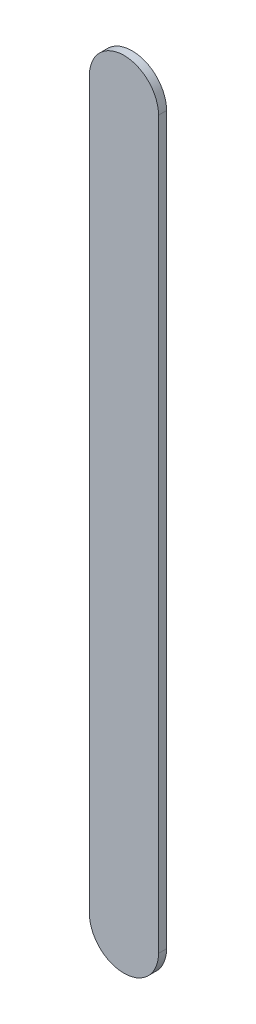
ISO-10303-21;
HEADER;
FILE_DESCRIPTION(('STEP AP214'),'2;1');
FILE_NAME('part.step','',(''),(''),'','','');
FILE_SCHEMA(('AUTOMOTIVE_DESIGN { 1 0 10303 214 1 1 1 1 }'));
ENDSEC;
DATA;
#1=APPLICATION_CONTEXT('core data for automotive mechanical design processes');
#2=APPLICATION_PROTOCOL_DEFINITION('international standard','automotive_design',2000,#1);
#3=PRODUCT_CONTEXT('',#1,'mechanical');
#4=PRODUCT('Part','Part','',(#3));
#5=PRODUCT_RELATED_PRODUCT_CATEGORY('part','',(#4));
#6=PRODUCT_DEFINITION_FORMATION('','',#4);
#7=PRODUCT_DEFINITION_CONTEXT('part definition',#1,'design');
#8=PRODUCT_DEFINITION('design','',#6,#7);
#9=PRODUCT_DEFINITION_SHAPE('','',#8);
#10=(LENGTH_UNIT() NAMED_UNIT(*) SI_UNIT(.MILLI.,.METRE.));
#11=(NAMED_UNIT(*) PLANE_ANGLE_UNIT() SI_UNIT($,.RADIAN.));
#12=(NAMED_UNIT(*) SI_UNIT($,.STERADIAN.) SOLID_ANGLE_UNIT());
#13=UNCERTAINTY_MEASURE_WITH_UNIT(LENGTH_MEASURE(1.E-05),#10,'distance_accuracy_value','');
#14=(GEOMETRIC_REPRESENTATION_CONTEXT(3) GLOBAL_UNCERTAINTY_ASSIGNED_CONTEXT((#13)) GLOBAL_UNIT_ASSIGNED_CONTEXT((#10,
#11,#12)) REPRESENTATION_CONTEXT('',''));
#15=CARTESIAN_POINT('',(0.,0.,0.));
#16=DIRECTION('',(0.,0.,1.));
#17=DIRECTION('',(1.,0.,0.));
#18=AXIS2_PLACEMENT_3D('',#15,#16,#17);
#19=CARTESIAN_POINT('',(131.518,-110.752,1.635));
#20=DIRECTION('',(0.,0.,1.));
#21=DIRECTION('',(1.,0.,0.));
#22=AXIS2_PLACEMENT_3D('',#19,#20,#21);
#23=PLANE('',#22);
#24=DIRECTION('',(0.,-1.,0.));
#25=VECTOR('',#24,1.);
#26=CARTESIAN_POINT('',(131.518,-110.752,1.635));
#27=LINE('',#26,#25);
#28=CARTESIAN_POINT('',(131.518,-110.752,1.635));
#29=VERTEX_POINT('',#28);
#30=CARTESIAN_POINT('',(131.518,-113.904,1.635));
#31=VERTEX_POINT('',#30);
#32=EDGE_CURVE('E93',#29,#31,#27,.T.);
#33=ORIENTED_EDGE('',*,*,#32,.T.);
#34=CARTESIAN_POINT('',(131.668,-113.904,1.635));
#35=DIRECTION('',(0.,0.,1.));
#36=DIRECTION('',(-1.,0.,0.));
#37=AXIS2_PLACEMENT_3D('',#34,#35,#36);
#38=CIRCLE('',#37,0.15);
#39=CARTESIAN_POINT('',(131.818,-113.904,1.635));
#40=VERTEX_POINT('',#39);
#41=EDGE_CURVE('E71',#31,#40,#38,.T.);
#42=ORIENTED_EDGE('',*,*,#41,.T.);
#43=DIRECTION('',(0.,1.,0.));
#44=VECTOR('',#43,1.);
#45=CARTESIAN_POINT('',(131.818,-113.904,1.635));
#46=LINE('',#45,#44);
#47=CARTESIAN_POINT('',(131.818,-110.752,1.635));
#48=VERTEX_POINT('',#47);
#49=EDGE_CURVE('E76',#40,#48,#46,.T.);
#50=ORIENTED_EDGE('',*,*,#49,.T.);
#51=CARTESIAN_POINT('',(131.668,-110.752,1.635));
#52=DIRECTION('',(0.,0.,1.));
#53=DIRECTION('',(1.,0.,0.));
#54=AXIS2_PLACEMENT_3D('',#51,#52,#53);
#55=CIRCLE('',#54,0.15);
#56=EDGE_CURVE('E11',#48,#29,#55,.T.);
#57=ORIENTED_EDGE('',*,*,#56,.T.);
#58=EDGE_LOOP('',(#33,#42,#50,#57));
#59=FACE_BOUND('',#58,.T.);
#60=ADVANCED_FACE('F17',(#59),#23,.T.);
#61=CARTESIAN_POINT('',(131.518,-110.752,1.6));
#62=DIRECTION('',(0.,0.,1.));
#63=DIRECTION('',(1.,0.,0.));
#64=AXIS2_PLACEMENT_3D('',#61,#62,#63);
#65=PLANE('',#64);
#66=CARTESIAN_POINT('',(131.668,-110.752,1.6));
#67=DIRECTION('',(0.,0.,1.));
#68=DIRECTION('',(1.,0.,0.));
#69=AXIS2_PLACEMENT_3D('',#66,#67,#68);
#70=CIRCLE('',#69,0.15);
#71=CARTESIAN_POINT('',(131.818,-110.752,1.6));
#72=VERTEX_POINT('',#71);
#73=CARTESIAN_POINT('',(131.518,-110.752,1.6));
#74=VERTEX_POINT('',#73);
#75=EDGE_CURVE('E20',#72,#74,#70,.T.);
#76=ORIENTED_EDGE('',*,*,#75,.F.);
#77=DIRECTION('',(0.,1.,0.));
#78=VECTOR('',#77,1.);
#79=CARTESIAN_POINT('',(131.818,-113.904,1.6));
#80=LINE('',#79,#78);
#81=CARTESIAN_POINT('',(131.818,-113.904,1.6));
#82=VERTEX_POINT('',#81);
#83=EDGE_CURVE('E60',#82,#72,#80,.T.);
#84=ORIENTED_EDGE('',*,*,#83,.F.);
#85=CARTESIAN_POINT('',(131.668,-113.904,1.6));
#86=DIRECTION('',(0.,0.,1.));
#87=DIRECTION('',(-1.,0.,0.));
#88=AXIS2_PLACEMENT_3D('',#85,#86,#87);
#89=CIRCLE('',#88,0.15);
#90=CARTESIAN_POINT('',(131.518,-113.904,1.6));
#91=VERTEX_POINT('',#90);
#92=EDGE_CURVE('E65',#91,#82,#89,.T.);
#93=ORIENTED_EDGE('',*,*,#92,.F.);
#94=DIRECTION('',(0.,-1.,0.));
#95=VECTOR('',#94,1.);
#96=CARTESIAN_POINT('',(131.518,-110.752,1.6));
#97=LINE('',#96,#95);
#98=EDGE_CURVE('E115',#74,#91,#97,.T.);
#99=ORIENTED_EDGE('',*,*,#98,.F.);
#100=EDGE_LOOP('',(#76,#84,#93,#99));
#101=FACE_BOUND('',#100,.T.);
#102=ADVANCED_FACE('F62',(#101),#65,.F.);
#103=CARTESIAN_POINT('',(131.668,-110.752,1.6));
#104=DIRECTION('',(0.,0.,-1.));
#105=DIRECTION('',(1.,0.,0.));
#106=AXIS2_PLACEMENT_3D('',#103,#104,#105);
#107=CYLINDRICAL_SURFACE('',#106,0.15);
#108=ORIENTED_EDGE('',*,*,#75,.T.);
#109=DIRECTION('',(0.,0.,1.));
#110=VECTOR('',#109,1.);
#111=CARTESIAN_POINT('',(131.518,-110.752,1.6));
#112=LINE('',#111,#110);
#113=EDGE_CURVE('E87',#74,#29,#112,.T.);
#114=ORIENTED_EDGE('',*,*,#113,.T.);
#115=ORIENTED_EDGE('',*,*,#56,.F.);
#116=DIRECTION('',(0.,0.,1.));
#117=VECTOR('',#116,1.);
#118=CARTESIAN_POINT('',(131.818,-110.752,1.6));
#119=LINE('',#118,#117);
#120=EDGE_CURVE('E70',#72,#48,#119,.T.);
#121=ORIENTED_EDGE('',*,*,#120,.F.);
#122=EDGE_LOOP('',(#108,#114,#115,#121));
#123=FACE_BOUND('',#122,.T.);
#124=ADVANCED_FACE('F109',(#123),#107,.T.);
#125=CARTESIAN_POINT('',(131.818,-113.904,1.6));
#126=DIRECTION('',(-1.,0.,0.));
#127=DIRECTION('',(0.,0.,1.));
#128=AXIS2_PLACEMENT_3D('',#125,#126,#127);
#129=PLANE('',#128);
#130=ORIENTED_EDGE('',*,*,#83,.T.);
#131=ORIENTED_EDGE('',*,*,#120,.T.);
#132=ORIENTED_EDGE('',*,*,#49,.F.);
#133=DIRECTION('',(0.,0.,1.));
#134=VECTOR('',#133,1.);
#135=CARTESIAN_POINT('',(131.818,-113.904,1.6));
#136=LINE('',#135,#134);
#137=EDGE_CURVE('E74',#82,#40,#136,.T.);
#138=ORIENTED_EDGE('',*,*,#137,.F.);
#139=EDGE_LOOP('',(#130,#131,#132,#138));
#140=FACE_BOUND('',#139,.T.);
#141=ADVANCED_FACE('F75',(#140),#129,.F.);
#142=CARTESIAN_POINT('',(131.668,-113.904,1.6));
#143=DIRECTION('',(0.,0.,-1.));
#144=DIRECTION('',(-1.,0.,0.));
#145=AXIS2_PLACEMENT_3D('',#142,#143,#144);
#146=CYLINDRICAL_SURFACE('',#145,0.15);
#147=ORIENTED_EDGE('',*,*,#92,.T.);
#148=ORIENTED_EDGE('',*,*,#137,.T.);
#149=ORIENTED_EDGE('',*,*,#41,.F.);
#150=DIRECTION('',(0.,0.,1.));
#151=VECTOR('',#150,1.);
#152=CARTESIAN_POINT('',(131.518,-113.904,1.6));
#153=LINE('',#152,#151);
#154=EDGE_CURVE('E84',#91,#31,#153,.T.);
#155=ORIENTED_EDGE('',*,*,#154,.F.);
#156=EDGE_LOOP('',(#147,#148,#149,#155));
#157=FACE_BOUND('',#156,.T.);
#158=ADVANCED_FACE('F82',(#157),#146,.T.);
#159=CARTESIAN_POINT('',(131.518,-110.752,1.6));
#160=DIRECTION('',(1.,0.,0.));
#161=DIRECTION('',(0.,1.,0.));
#162=AXIS2_PLACEMENT_3D('',#159,#160,#161);
#163=PLANE('',#162);
#164=ORIENTED_EDGE('',*,*,#98,.T.);
#165=ORIENTED_EDGE('',*,*,#154,.T.);
#166=ORIENTED_EDGE('',*,*,#32,.F.);
#167=ORIENTED_EDGE('',*,*,#113,.F.);
#168=EDGE_LOOP('',(#164,#165,#166,#167));
#169=FACE_BOUND('',#168,.T.);
#170=ADVANCED_FACE('F114',(#169),#163,.F.);
#171=CLOSED_SHELL('',(#60,#102,#124,#141,#158,#170));
#172=MANIFOLD_SOLID_BREP('B1',#171);
#173=ADVANCED_BREP_SHAPE_REPRESENTATION('',(#18,#172),#14);
#174=SHAPE_DEFINITION_REPRESENTATION(#9,#173);
ENDSEC;
END-ISO-10303-21;
